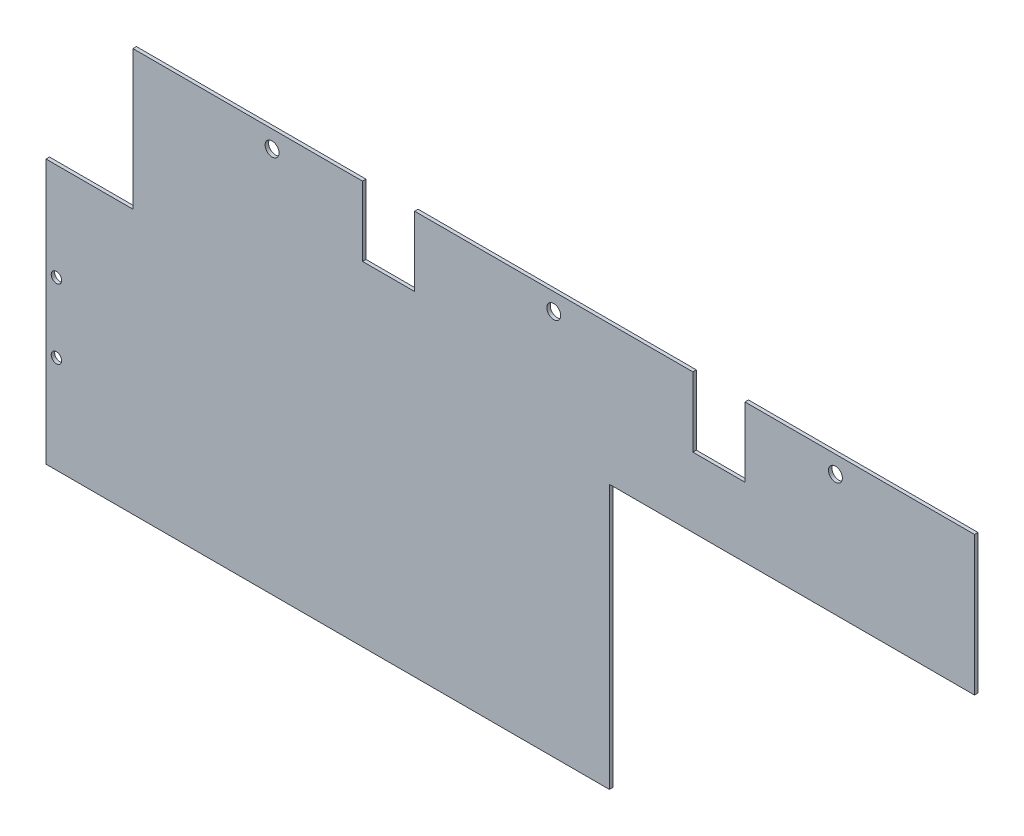
ISO-10303-21;
HEADER;
FILE_DESCRIPTION(('STEP AP214'),'2;1');
FILE_NAME('part.step','',(''),(''),'','','');
FILE_SCHEMA(('AUTOMOTIVE_DESIGN { 1 0 10303 214 1 1 1 1 }'));
ENDSEC;
DATA;
#1=APPLICATION_CONTEXT('core data for automotive mechanical design processes');
#2=APPLICATION_PROTOCOL_DEFINITION('international standard','automotive_design',2000,#1);
#3=PRODUCT_CONTEXT('',#1,'mechanical');
#4=PRODUCT('Part','Part','',(#3));
#5=PRODUCT_RELATED_PRODUCT_CATEGORY('part','',(#4));
#6=PRODUCT_DEFINITION_FORMATION('','',#4);
#7=PRODUCT_DEFINITION_CONTEXT('part definition',#1,'design');
#8=PRODUCT_DEFINITION('design','',#6,#7);
#9=PRODUCT_DEFINITION_SHAPE('','',#8);
#10=(LENGTH_UNIT() NAMED_UNIT(*) SI_UNIT(.MILLI.,.METRE.));
#11=(NAMED_UNIT(*) PLANE_ANGLE_UNIT() SI_UNIT($,.RADIAN.));
#12=(NAMED_UNIT(*) SI_UNIT($,.STERADIAN.) SOLID_ANGLE_UNIT());
#13=UNCERTAINTY_MEASURE_WITH_UNIT(LENGTH_MEASURE(1.E-05),#10,'distance_accuracy_value','');
#14=(GEOMETRIC_REPRESENTATION_CONTEXT(3) GLOBAL_UNCERTAINTY_ASSIGNED_CONTEXT((#13)) GLOBAL_UNIT_ASSIGNED_CONTEXT((#10,
#11,#12)) REPRESENTATION_CONTEXT('',''));
#15=CARTESIAN_POINT('',(0.,0.,0.));
#16=DIRECTION('',(0.,0.,1.));
#17=DIRECTION('',(1.,0.,0.));
#18=AXIS2_PLACEMENT_3D('',#15,#16,#17);
#19=CARTESIAN_POINT('',(25.,116.,1.));
#20=DIRECTION('',(0.,-1.,0.));
#21=DIRECTION('',(0.,0.,-1.));
#22=AXIS2_PLACEMENT_3D('',#19,#20,#21);
#23=PLANE('',#22);
#24=DIRECTION('',(-1.,0.,0.));
#25=VECTOR('',#24,1.);
#26=CARTESIAN_POINT('',(25.,116.,0.));
#27=LINE('',#26,#25);
#28=CARTESIAN_POINT('',(267.,116.,0.));
#29=VERTEX_POINT('',#28);
#30=CARTESIAN_POINT('',(201.,116.,0.));
#31=VERTEX_POINT('',#30);
#32=EDGE_CURVE('E278',#29,#31,#27,.T.);
#33=ORIENTED_EDGE('',*,*,#32,.T.);
#34=DIRECTION('',(0.,0.,1.));
#35=VECTOR('',#34,1.);
#36=CARTESIAN_POINT('',(201.,116.,0.));
#37=LINE('',#36,#35);
#38=CARTESIAN_POINT('',(201.,116.,1.));
#39=VERTEX_POINT('',#38);
#40=EDGE_CURVE('E208',#31,#39,#37,.T.);
#41=ORIENTED_EDGE('',*,*,#40,.T.);
#42=DIRECTION('',(-1.,0.,0.));
#43=VECTOR('',#42,1.);
#44=CARTESIAN_POINT('',(25.,116.,1.));
#45=LINE('',#44,#43);
#46=CARTESIAN_POINT('',(267.,116.,1.));
#47=VERTEX_POINT('',#46);
#48=EDGE_CURVE('E264',#47,#39,#45,.T.);
#49=ORIENTED_EDGE('',*,*,#48,.F.);
#50=DIRECTION('',(0.,0.,-1.));
#51=VECTOR('',#50,1.);
#52=CARTESIAN_POINT('',(267.,116.,1.));
#53=LINE('',#52,#51);
#54=EDGE_CURVE('E44',#47,#29,#53,.T.);
#55=ORIENTED_EDGE('',*,*,#54,.T.);
#56=EDGE_LOOP('',(#33,#41,#49,#55));
#57=FACE_BOUND('',#56,.T.);
#58=ADVANCED_FACE('F36',(#57),#23,.F.);
#59=CARTESIAN_POINT('',(91.,116.,1.));
#60=VERTEX_POINT('',#59);
#61=CARTESIAN_POINT('',(25.,116.,1.));
#62=VERTEX_POINT('',#61);
#63=EDGE_CURVE('E263',#60,#62,#45,.T.);
#64=ORIENTED_EDGE('',*,*,#63,.F.);
#65=DIRECTION('',(0.,0.,1.));
#66=VECTOR('',#65,1.);
#67=CARTESIAN_POINT('',(91.,116.,0.));
#68=LINE('',#67,#66);
#69=CARTESIAN_POINT('',(91.,116.,0.));
#70=VERTEX_POINT('',#69);
#71=EDGE_CURVE('E237',#70,#60,#68,.T.);
#72=ORIENTED_EDGE('',*,*,#71,.F.);
#73=CARTESIAN_POINT('',(25.,116.,0.));
#74=VERTEX_POINT('',#73);
#75=EDGE_CURVE('E277',#70,#74,#27,.T.);
#76=ORIENTED_EDGE('',*,*,#75,.T.);
#77=DIRECTION('',(0.,0.,-1.));
#78=VECTOR('',#77,1.);
#79=CARTESIAN_POINT('',(25.,116.,1.));
#80=LINE('',#79,#78);
#81=EDGE_CURVE('E295',#62,#74,#80,.T.);
#82=ORIENTED_EDGE('',*,*,#81,.F.);
#83=EDGE_LOOP('',(#64,#72,#76,#82));
#84=FACE_BOUND('',#83,.T.);
#85=ADVANCED_FACE('F322',(#84),#23,.F.);
#86=CARTESIAN_POINT('',(0.,0.,1.));
#87=DIRECTION('',(0.,0.,-1.));
#88=DIRECTION('',(-1.,0.,0.));
#89=AXIS2_PLACEMENT_3D('',#86,#87,#88);
#90=PLANE('',#89);
#91=CARTESIAN_POINT('',(65.,111.,1.));
#92=DIRECTION('',(0.,0.,1.));
#93=DIRECTION('',(1.,0.,0.));
#94=AXIS2_PLACEMENT_3D('',#91,#92,#93);
#95=CIRCLE('',#94,2.);
#96=CARTESIAN_POINT('',(67.,111.,1.));
#97=VERTEX_POINT('',#96);
#98=EDGE_CURVE('E182',#97,#97,#95,.T.);
#99=ORIENTED_EDGE('',*,*,#98,.F.);
#100=EDGE_LOOP('',(#99));
#101=FACE_BOUND('',#100,.T.);
#102=CARTESIAN_POINT('',(227.,111.,1.));
#103=DIRECTION('',(0.,0.,1.));
#104=DIRECTION('',(-1.,0.,0.));
#105=AXIS2_PLACEMENT_3D('',#102,#103,#104);
#106=CIRCLE('',#105,2.);
#107=CARTESIAN_POINT('',(225.,111.,1.));
#108=VERTEX_POINT('',#107);
#109=EDGE_CURVE('E183',#108,#108,#106,.T.);
#110=ORIENTED_EDGE('',*,*,#109,.F.);
#111=EDGE_LOOP('',(#110));
#112=FACE_BOUND('',#111,.T.);
#113=CARTESIAN_POINT('',(146.,111.,1.));
#114=DIRECTION('',(0.,0.,1.));
#115=DIRECTION('',(1.,0.,0.));
#116=AXIS2_PLACEMENT_3D('',#113,#114,#115);
#117=CIRCLE('',#116,2.);
#118=CARTESIAN_POINT('',(148.,111.,1.));
#119=VERTEX_POINT('',#118);
#120=EDGE_CURVE('E177',#119,#119,#117,.T.);
#121=ORIENTED_EDGE('',*,*,#120,.F.);
#122=EDGE_LOOP('',(#121));
#123=FACE_BOUND('',#122,.T.);
#124=DIRECTION('',(1.,0.,0.));
#125=VECTOR('',#124,1.);
#126=CARTESIAN_POINT('',(292.,0.,1.));
#127=LINE('',#126,#125);
#128=CARTESIAN_POINT('',(0.,0.,1.));
#129=VERTEX_POINT('',#128);
#130=CARTESIAN_POINT('',(162.,0.,1.));
#131=VERTEX_POINT('',#130);
#132=EDGE_CURVE('E257',#129,#131,#127,.T.);
#133=ORIENTED_EDGE('',*,*,#132,.T.);
#134=DIRECTION('',(0.,-1.,0.));
#135=VECTOR('',#134,1.);
#136=CARTESIAN_POINT('',(162.,0.,1.));
#137=LINE('',#136,#135);
#138=CARTESIAN_POINT('',(162.,76.,1.));
#139=VERTEX_POINT('',#138);
#140=EDGE_CURVE('E172',#139,#131,#137,.T.);
#141=ORIENTED_EDGE('',*,*,#140,.F.);
#142=DIRECTION('',(-1.,0.,0.));
#143=VECTOR('',#142,1.);
#144=CARTESIAN_POINT('',(292.,76.,1.));
#145=LINE('',#144,#143);
#146=CARTESIAN_POINT('',(267.,76.,1.));
#147=VERTEX_POINT('',#146);
#148=EDGE_CURVE('E154',#147,#139,#145,.T.);
#149=ORIENTED_EDGE('',*,*,#148,.F.);
#150=DIRECTION('',(0.,1.,0.));
#151=VECTOR('',#150,1.);
#152=CARTESIAN_POINT('',(267.,116.,1.));
#153=LINE('',#152,#151);
#154=EDGE_CURVE('E260',#147,#47,#153,.T.);
#155=ORIENTED_EDGE('',*,*,#154,.T.);
#156=ORIENTED_EDGE('',*,*,#48,.T.);
#157=DIRECTION('',(0.,1.,0.));
#158=VECTOR('',#157,1.);
#159=CARTESIAN_POINT('',(201.,116.,1.));
#160=LINE('',#159,#158);
#161=CARTESIAN_POINT('',(201.,96.,1.));
#162=VERTEX_POINT('',#161);
#163=EDGE_CURVE('E193',#162,#39,#160,.T.);
#164=ORIENTED_EDGE('',*,*,#163,.F.);
#165=DIRECTION('',(1.,0.,0.));
#166=VECTOR('',#165,1.);
#167=CARTESIAN_POINT('',(201.,96.,1.));
#168=LINE('',#167,#166);
#169=CARTESIAN_POINT('',(186.,96.,1.));
#170=VERTEX_POINT('',#169);
#171=EDGE_CURVE('E203',#170,#162,#168,.T.);
#172=ORIENTED_EDGE('',*,*,#171,.F.);
#173=DIRECTION('',(0.,-1.,0.));
#174=VECTOR('',#173,1.);
#175=CARTESIAN_POINT('',(186.,116.,1.));
#176=LINE('',#175,#174);
#177=CARTESIAN_POINT('',(186.,116.,1.));
#178=VERTEX_POINT('',#177);
#179=EDGE_CURVE('E200',#178,#170,#176,.T.);
#180=ORIENTED_EDGE('',*,*,#179,.F.);
#181=CARTESIAN_POINT('',(106.,116.,1.));
#182=VERTEX_POINT('',#181);
#183=EDGE_CURVE('E268',#178,#182,#45,.T.);
#184=ORIENTED_EDGE('',*,*,#183,.T.);
#185=DIRECTION('',(0.,1.,0.));
#186=VECTOR('',#185,1.);
#187=CARTESIAN_POINT('',(106.,116.,1.));
#188=LINE('',#187,#186);
#189=CARTESIAN_POINT('',(106.,96.,1.));
#190=VERTEX_POINT('',#189);
#191=EDGE_CURVE('E51',#190,#182,#188,.T.);
#192=ORIENTED_EDGE('',*,*,#191,.F.);
#193=DIRECTION('',(1.,0.,0.));
#194=VECTOR('',#193,1.);
#195=CARTESIAN_POINT('',(91.,96.,1.));
#196=LINE('',#195,#194);
#197=CARTESIAN_POINT('',(91.,96.,1.));
#198=VERTEX_POINT('',#197);
#199=EDGE_CURVE('E233',#198,#190,#196,.T.);
#200=ORIENTED_EDGE('',*,*,#199,.F.);
#201=DIRECTION('',(0.,-1.,0.));
#202=VECTOR('',#201,1.);
#203=CARTESIAN_POINT('',(91.,116.,1.));
#204=LINE('',#203,#202);
#205=EDGE_CURVE('E211',#60,#198,#204,.T.);
#206=ORIENTED_EDGE('',*,*,#205,.F.);
#207=ORIENTED_EDGE('',*,*,#63,.T.);
#208=DIRECTION('',(0.,-1.,0.));
#209=VECTOR('',#208,1.);
#210=CARTESIAN_POINT('',(25.,76.,1.));
#211=LINE('',#210,#209);
#212=CARTESIAN_POINT('',(25.,76.,1.));
#213=VERTEX_POINT('',#212);
#214=EDGE_CURVE('E267',#62,#213,#211,.T.);
#215=ORIENTED_EDGE('',*,*,#214,.T.);
#216=DIRECTION('',(-1.,0.,0.));
#217=VECTOR('',#216,1.);
#218=CARTESIAN_POINT('',(0.,76.,1.));
#219=LINE('',#218,#217);
#220=CARTESIAN_POINT('',(0.,76.,1.));
#221=VERTEX_POINT('',#220);
#222=EDGE_CURVE('E270',#213,#221,#219,.T.);
#223=ORIENTED_EDGE('',*,*,#222,.T.);
#224=DIRECTION('',(0.,-1.,0.));
#225=VECTOR('',#224,1.);
#226=CARTESIAN_POINT('',(0.,0.,1.));
#227=LINE('',#226,#225);
#228=EDGE_CURVE('E272',#221,#129,#227,.T.);
#229=ORIENTED_EDGE('',*,*,#228,.T.);
#230=EDGE_LOOP('',(#133,#141,#149,#155,#156,#164,#172,#180,#184,#192,#200,#206,#207,#215,#223,#229));
#231=FACE_BOUND('',#230,.T.);
#232=CARTESIAN_POINT('',(3.,48.,1.));
#233=DIRECTION('',(0.,0.,1.));
#234=DIRECTION('',(1.,0.,0.));
#235=AXIS2_PLACEMENT_3D('',#232,#233,#234);
#236=CIRCLE('',#235,1.5);
#237=CARTESIAN_POINT('',(4.5,48.,1.));
#238=VERTEX_POINT('',#237);
#239=EDGE_CURVE('E251',#238,#238,#236,.T.);
#240=ORIENTED_EDGE('',*,*,#239,.F.);
#241=EDGE_LOOP('',(#240));
#242=FACE_BOUND('',#241,.T.);
#243=CARTESIAN_POINT('',(3.,28.,1.));
#244=DIRECTION('',(0.,0.,1.));
#245=DIRECTION('',(1.,0.,0.));
#246=AXIS2_PLACEMENT_3D('',#243,#244,#245);
#247=CIRCLE('',#246,1.5);
#248=CARTESIAN_POINT('',(4.5,28.,1.));
#249=VERTEX_POINT('',#248);
#250=EDGE_CURVE('E245',#249,#249,#247,.T.);
#251=ORIENTED_EDGE('',*,*,#250,.F.);
#252=EDGE_LOOP('',(#251));
#253=FACE_BOUND('',#252,.T.);
#254=ADVANCED_FACE('F309',(#101,#112,#123,#231,#242,#253),#90,.F.);
#255=CARTESIAN_POINT('',(0.,0.,0.));
#256=DIRECTION('',(0.,0.,-1.));
#257=DIRECTION('',(-1.,0.,0.));
#258=AXIS2_PLACEMENT_3D('',#255,#256,#257);
#259=PLANE('',#258);
#260=DIRECTION('',(0.,-1.,0.));
#261=VECTOR('',#260,1.);
#262=CARTESIAN_POINT('',(162.,0.,0.));
#263=LINE('',#262,#261);
#264=CARTESIAN_POINT('',(162.,76.,0.));
#265=VERTEX_POINT('',#264);
#266=CARTESIAN_POINT('',(162.,0.,0.));
#267=VERTEX_POINT('',#266);
#268=EDGE_CURVE('E158',#265,#267,#263,.T.);
#269=ORIENTED_EDGE('',*,*,#268,.T.);
#270=DIRECTION('',(1.,0.,0.));
#271=VECTOR('',#270,1.);
#272=CARTESIAN_POINT('',(292.,0.,0.));
#273=LINE('',#272,#271);
#274=CARTESIAN_POINT('',(0.,0.,0.));
#275=VERTEX_POINT('',#274);
#276=EDGE_CURVE('E254',#275,#267,#273,.T.);
#277=ORIENTED_EDGE('',*,*,#276,.F.);
#278=DIRECTION('',(0.,-1.,0.));
#279=VECTOR('',#278,1.);
#280=CARTESIAN_POINT('',(0.,0.,0.));
#281=LINE('',#280,#279);
#282=CARTESIAN_POINT('',(0.,76.,0.));
#283=VERTEX_POINT('',#282);
#284=EDGE_CURVE('E261',#283,#275,#281,.T.);
#285=ORIENTED_EDGE('',*,*,#284,.F.);
#286=DIRECTION('',(-1.,0.,0.));
#287=VECTOR('',#286,1.);
#288=CARTESIAN_POINT('',(0.,76.,0.));
#289=LINE('',#288,#287);
#290=CARTESIAN_POINT('',(25.,76.,0.));
#291=VERTEX_POINT('',#290);
#292=EDGE_CURVE('E284',#291,#283,#289,.T.);
#293=ORIENTED_EDGE('',*,*,#292,.F.);
#294=DIRECTION('',(0.,-1.,0.));
#295=VECTOR('',#294,1.);
#296=CARTESIAN_POINT('',(25.,76.,0.));
#297=LINE('',#296,#295);
#298=EDGE_CURVE('E281',#74,#291,#297,.T.);
#299=ORIENTED_EDGE('',*,*,#298,.F.);
#300=ORIENTED_EDGE('',*,*,#75,.F.);
#301=DIRECTION('',(0.,-1.,0.));
#302=VECTOR('',#301,1.);
#303=CARTESIAN_POINT('',(91.,116.,0.));
#304=LINE('',#303,#302);
#305=CARTESIAN_POINT('',(91.,96.,0.));
#306=VERTEX_POINT('',#305);
#307=EDGE_CURVE('E221',#70,#306,#304,.T.);
#308=ORIENTED_EDGE('',*,*,#307,.T.);
#309=DIRECTION('',(1.,0.,0.));
#310=VECTOR('',#309,1.);
#311=CARTESIAN_POINT('',(91.,96.,0.));
#312=LINE('',#311,#310);
#313=CARTESIAN_POINT('',(106.,96.,0.));
#314=VERTEX_POINT('',#313);
#315=EDGE_CURVE('E224',#306,#314,#312,.T.);
#316=ORIENTED_EDGE('',*,*,#315,.T.);
#317=DIRECTION('',(0.,1.,0.));
#318=VECTOR('',#317,1.);
#319=CARTESIAN_POINT('',(106.,116.,0.));
#320=LINE('',#319,#318);
#321=CARTESIAN_POINT('',(106.,116.,0.));
#322=VERTEX_POINT('',#321);
#323=EDGE_CURVE('E227',#314,#322,#320,.T.);
#324=ORIENTED_EDGE('',*,*,#323,.T.);
#325=CARTESIAN_POINT('',(186.,116.,0.));
#326=VERTEX_POINT('',#325);
#327=EDGE_CURVE('E282',#326,#322,#27,.T.);
#328=ORIENTED_EDGE('',*,*,#327,.F.);
#329=DIRECTION('',(0.,-1.,0.));
#330=VECTOR('',#329,1.);
#331=CARTESIAN_POINT('',(186.,116.,0.));
#332=LINE('',#331,#330);
#333=CARTESIAN_POINT('',(186.,96.,0.));
#334=VERTEX_POINT('',#333);
#335=EDGE_CURVE('E59',#326,#334,#332,.T.);
#336=ORIENTED_EDGE('',*,*,#335,.T.);
#337=DIRECTION('',(1.,0.,0.));
#338=VECTOR('',#337,1.);
#339=CARTESIAN_POINT('',(201.,96.,0.));
#340=LINE('',#339,#338);
#341=CARTESIAN_POINT('',(201.,96.,0.));
#342=VERTEX_POINT('',#341);
#343=EDGE_CURVE('E192',#334,#342,#340,.T.);
#344=ORIENTED_EDGE('',*,*,#343,.T.);
#345=DIRECTION('',(0.,1.,0.));
#346=VECTOR('',#345,1.);
#347=CARTESIAN_POINT('',(201.,116.,0.));
#348=LINE('',#347,#346);
#349=EDGE_CURVE('E196',#342,#31,#348,.T.);
#350=ORIENTED_EDGE('',*,*,#349,.T.);
#351=ORIENTED_EDGE('',*,*,#32,.F.);
#352=DIRECTION('',(0.,1.,0.));
#353=VECTOR('',#352,1.);
#354=CARTESIAN_POINT('',(267.,116.,0.));
#355=LINE('',#354,#353);
#356=CARTESIAN_POINT('',(267.,76.,0.));
#357=VERTEX_POINT('',#356);
#358=EDGE_CURVE('E171',#357,#29,#355,.T.);
#359=ORIENTED_EDGE('',*,*,#358,.F.);
#360=DIRECTION('',(-1.,0.,0.));
#361=VECTOR('',#360,1.);
#362=CARTESIAN_POINT('',(292.,76.,0.));
#363=LINE('',#362,#361);
#364=EDGE_CURVE('E152',#357,#265,#363,.T.);
#365=ORIENTED_EDGE('',*,*,#364,.T.);
#366=EDGE_LOOP('',(#269,#277,#285,#293,#299,#300,#308,#316,#324,#328,#336,#344,#350,#351,#359,#365));
#367=FACE_BOUND('',#366,.T.);
#368=CARTESIAN_POINT('',(65.,111.,0.));
#369=DIRECTION('',(0.,0.,1.));
#370=DIRECTION('',(1.,0.,0.));
#371=AXIS2_PLACEMENT_3D('',#368,#369,#370);
#372=CIRCLE('',#371,2.);
#373=CARTESIAN_POINT('',(67.,111.,0.));
#374=VERTEX_POINT('',#373);
#375=EDGE_CURVE('E204',#374,#374,#372,.T.);
#376=ORIENTED_EDGE('',*,*,#375,.T.);
#377=EDGE_LOOP('',(#376));
#378=FACE_BOUND('',#377,.T.);
#379=CARTESIAN_POINT('',(227.,111.,0.));
#380=DIRECTION('',(0.,0.,1.));
#381=DIRECTION('',(-1.,0.,0.));
#382=AXIS2_PLACEMENT_3D('',#379,#380,#381);
#383=CIRCLE('',#382,2.);
#384=CARTESIAN_POINT('',(225.,111.,0.));
#385=VERTEX_POINT('',#384);
#386=EDGE_CURVE('E179',#385,#385,#383,.T.);
#387=ORIENTED_EDGE('',*,*,#386,.T.);
#388=EDGE_LOOP('',(#387));
#389=FACE_BOUND('',#388,.T.);
#390=CARTESIAN_POINT('',(146.,111.,0.));
#391=DIRECTION('',(0.,0.,1.));
#392=DIRECTION('',(1.,0.,0.));
#393=AXIS2_PLACEMENT_3D('',#390,#391,#392);
#394=CIRCLE('',#393,2.);
#395=CARTESIAN_POINT('',(148.,111.,0.));
#396=VERTEX_POINT('',#395);
#397=EDGE_CURVE('E186',#396,#396,#394,.T.);
#398=ORIENTED_EDGE('',*,*,#397,.T.);
#399=EDGE_LOOP('',(#398));
#400=FACE_BOUND('',#399,.T.);
#401=CARTESIAN_POINT('',(3.,48.,0.));
#402=DIRECTION('',(0.,0.,1.));
#403=DIRECTION('',(1.,0.,0.));
#404=AXIS2_PLACEMENT_3D('',#401,#402,#403);
#405=CIRCLE('',#404,1.5);
#406=CARTESIAN_POINT('',(4.5,48.,0.));
#407=VERTEX_POINT('',#406);
#408=EDGE_CURVE('E248',#407,#407,#405,.T.);
#409=ORIENTED_EDGE('',*,*,#408,.T.);
#410=EDGE_LOOP('',(#409));
#411=FACE_BOUND('',#410,.T.);
#412=CARTESIAN_POINT('',(3.,28.,0.));
#413=DIRECTION('',(0.,0.,1.));
#414=DIRECTION('',(1.,0.,0.));
#415=AXIS2_PLACEMENT_3D('',#412,#413,#414);
#416=CIRCLE('',#415,1.5);
#417=CARTESIAN_POINT('',(4.5,28.,0.));
#418=VERTEX_POINT('',#417);
#419=EDGE_CURVE('E239',#418,#418,#416,.T.);
#420=ORIENTED_EDGE('',*,*,#419,.T.);
#421=EDGE_LOOP('',(#420));
#422=FACE_BOUND('',#421,.T.);
#423=ADVANCED_FACE('F168',(#367,#378,#389,#400,#411,#422),#259,.T.);
#424=CARTESIAN_POINT('',(292.,0.,1.));
#425=DIRECTION('',(0.,1.,0.));
#426=DIRECTION('',(0.,0.,1.));
#427=AXIS2_PLACEMENT_3D('',#424,#425,#426);
#428=PLANE('',#427);
#429=ORIENTED_EDGE('',*,*,#276,.T.);
#430=DIRECTION('',(0.,0.,1.));
#431=VECTOR('',#430,1.);
#432=CARTESIAN_POINT('',(162.,0.,0.));
#433=LINE('',#432,#431);
#434=EDGE_CURVE('E157',#267,#131,#433,.T.);
#435=ORIENTED_EDGE('',*,*,#434,.T.);
#436=ORIENTED_EDGE('',*,*,#132,.F.);
#437=DIRECTION('',(0.,0.,-1.));
#438=VECTOR('',#437,1.);
#439=CARTESIAN_POINT('',(0.,0.,1.));
#440=LINE('',#439,#438);
#441=EDGE_CURVE('E274',#129,#275,#440,.T.);
#442=ORIENTED_EDGE('',*,*,#441,.T.);
#443=EDGE_LOOP('',(#429,#435,#436,#442));
#444=FACE_BOUND('',#443,.T.);
#445=ADVANCED_FACE('F38',(#444),#428,.F.);
#446=CARTESIAN_POINT('',(267.,116.,1.));
#447=DIRECTION('',(-1.,0.,0.));
#448=DIRECTION('',(0.,0.,1.));
#449=AXIS2_PLACEMENT_3D('',#446,#447,#448);
#450=PLANE('',#449);
#451=ORIENTED_EDGE('',*,*,#358,.T.);
#452=ORIENTED_EDGE('',*,*,#54,.F.);
#453=ORIENTED_EDGE('',*,*,#154,.F.);
#454=DIRECTION('',(0.,0.,-1.));
#455=VECTOR('',#454,1.);
#456=CARTESIAN_POINT('',(267.,76.,1.));
#457=LINE('',#456,#455);
#458=EDGE_CURVE('E11',#147,#357,#457,.T.);
#459=ORIENTED_EDGE('',*,*,#458,.T.);
#460=EDGE_LOOP('',(#451,#452,#453,#459));
#461=FACE_BOUND('',#460,.T.);
#462=ADVANCED_FACE('F312',(#461),#450,.F.);
#463=ORIENTED_EDGE('',*,*,#183,.F.);
#464=DIRECTION('',(0.,0.,1.));
#465=VECTOR('',#464,1.);
#466=CARTESIAN_POINT('',(186.,116.,0.));
#467=LINE('',#466,#465);
#468=EDGE_CURVE('E199',#326,#178,#467,.T.);
#469=ORIENTED_EDGE('',*,*,#468,.F.);
#470=ORIENTED_EDGE('',*,*,#327,.T.);
#471=DIRECTION('',(0.,0.,1.));
#472=VECTOR('',#471,1.);
#473=CARTESIAN_POINT('',(106.,116.,0.));
#474=LINE('',#473,#472);
#475=EDGE_CURVE('E240',#322,#182,#474,.T.);
#476=ORIENTED_EDGE('',*,*,#475,.T.);
#477=EDGE_LOOP('',(#463,#469,#470,#476));
#478=FACE_BOUND('',#477,.T.);
#479=ADVANCED_FACE('F314',(#478),#23,.F.);
#480=CARTESIAN_POINT('',(25.,76.,1.));
#481=DIRECTION('',(1.,0.,0.));
#482=DIRECTION('',(0.,0.,-1.));
#483=AXIS2_PLACEMENT_3D('',#480,#481,#482);
#484=PLANE('',#483);
#485=ORIENTED_EDGE('',*,*,#298,.T.);
#486=DIRECTION('',(0.,0.,-1.));
#487=VECTOR('',#486,1.);
#488=CARTESIAN_POINT('',(25.,76.,1.));
#489=LINE('',#488,#487);
#490=EDGE_CURVE('E292',#213,#291,#489,.T.);
#491=ORIENTED_EDGE('',*,*,#490,.F.);
#492=ORIENTED_EDGE('',*,*,#214,.F.);
#493=ORIENTED_EDGE('',*,*,#81,.T.);
#494=EDGE_LOOP('',(#485,#491,#492,#493));
#495=FACE_BOUND('',#494,.T.);
#496=ADVANCED_FACE('F319',(#495),#484,.F.);
#497=CARTESIAN_POINT('',(0.,76.,1.));
#498=DIRECTION('',(0.,-1.,0.));
#499=DIRECTION('',(1.,0.,0.));
#500=AXIS2_PLACEMENT_3D('',#497,#498,#499);
#501=PLANE('',#500);
#502=ORIENTED_EDGE('',*,*,#292,.T.);
#503=DIRECTION('',(0.,0.,-1.));
#504=VECTOR('',#503,1.);
#505=CARTESIAN_POINT('',(0.,76.,1.));
#506=LINE('',#505,#504);
#507=EDGE_CURVE('E289',#221,#283,#506,.T.);
#508=ORIENTED_EDGE('',*,*,#507,.F.);
#509=ORIENTED_EDGE('',*,*,#222,.F.);
#510=ORIENTED_EDGE('',*,*,#490,.T.);
#511=EDGE_LOOP('',(#502,#508,#509,#510));
#512=FACE_BOUND('',#511,.T.);
#513=ADVANCED_FACE('F332',(#512),#501,.F.);
#514=CARTESIAN_POINT('',(0.,0.,1.));
#515=DIRECTION('',(1.,0.,0.));
#516=DIRECTION('',(0.,0.,-1.));
#517=AXIS2_PLACEMENT_3D('',#514,#515,#516);
#518=PLANE('',#517);
#519=ORIENTED_EDGE('',*,*,#284,.T.);
#520=ORIENTED_EDGE('',*,*,#441,.F.);
#521=ORIENTED_EDGE('',*,*,#228,.F.);
#522=ORIENTED_EDGE('',*,*,#507,.T.);
#523=EDGE_LOOP('',(#519,#520,#521,#522));
#524=FACE_BOUND('',#523,.T.);
#525=ADVANCED_FACE('F336',(#524),#518,.F.);
#526=CARTESIAN_POINT('',(3.,48.,1.));
#527=DIRECTION('',(0.,0.,-1.));
#528=DIRECTION('',(-1.,0.,0.));
#529=AXIS2_PLACEMENT_3D('',#526,#527,#528);
#530=CYLINDRICAL_SURFACE('',#529,1.5);
#531=ORIENTED_EDGE('',*,*,#239,.T.);
#532=EDGE_LOOP('',(#531));
#533=FACE_BOUND('',#532,.T.);
#534=ORIENTED_EDGE('',*,*,#408,.F.);
#535=EDGE_LOOP('',(#534));
#536=FACE_BOUND('',#535,.T.);
#537=ADVANCED_FACE('F340',(#533,#536),#530,.F.);
#538=CARTESIAN_POINT('',(3.,28.,1.));
#539=DIRECTION('',(0.,0.,-1.));
#540=DIRECTION('',(-1.,0.,0.));
#541=AXIS2_PLACEMENT_3D('',#538,#539,#540);
#542=CYLINDRICAL_SURFACE('',#541,1.5);
#543=ORIENTED_EDGE('',*,*,#250,.T.);
#544=EDGE_LOOP('',(#543));
#545=FACE_BOUND('',#544,.T.);
#546=ORIENTED_EDGE('',*,*,#419,.F.);
#547=EDGE_LOOP('',(#546));
#548=FACE_BOUND('',#547,.T.);
#549=ADVANCED_FACE('F349',(#545,#548),#542,.F.);
#550=CARTESIAN_POINT('',(91.,116.,0.));
#551=DIRECTION('',(-1.,0.,0.));
#552=DIRECTION('',(0.,0.,1.));
#553=AXIS2_PLACEMENT_3D('',#550,#551,#552);
#554=PLANE('',#553);
#555=ORIENTED_EDGE('',*,*,#205,.T.);
#556=DIRECTION('',(0.,0.,1.));
#557=VECTOR('',#556,1.);
#558=CARTESIAN_POINT('',(91.,96.,0.));
#559=LINE('',#558,#557);
#560=EDGE_CURVE('E230',#306,#198,#559,.T.);
#561=ORIENTED_EDGE('',*,*,#560,.F.);
#562=ORIENTED_EDGE('',*,*,#307,.F.);
#563=ORIENTED_EDGE('',*,*,#71,.T.);
#564=EDGE_LOOP('',(#555,#561,#562,#563));
#565=FACE_BOUND('',#564,.T.);
#566=ADVANCED_FACE('F353',(#565),#554,.F.);
#567=CARTESIAN_POINT('',(106.,116.,0.));
#568=DIRECTION('',(1.,0.,0.));
#569=DIRECTION('',(0.,1.,0.));
#570=AXIS2_PLACEMENT_3D('',#567,#568,#569);
#571=PLANE('',#570);
#572=ORIENTED_EDGE('',*,*,#191,.T.);
#573=ORIENTED_EDGE('',*,*,#475,.F.);
#574=ORIENTED_EDGE('',*,*,#323,.F.);
#575=DIRECTION('',(0.,0.,1.));
#576=VECTOR('',#575,1.);
#577=CARTESIAN_POINT('',(106.,96.,0.));
#578=LINE('',#577,#576);
#579=EDGE_CURVE('E242',#314,#190,#578,.T.);
#580=ORIENTED_EDGE('',*,*,#579,.T.);
#581=EDGE_LOOP('',(#572,#573,#574,#580));
#582=FACE_BOUND('',#581,.T.);
#583=ADVANCED_FACE('F357',(#582),#571,.F.);
#584=CARTESIAN_POINT('',(91.,96.,0.));
#585=DIRECTION('',(0.,-1.,0.));
#586=DIRECTION('',(0.,0.,-1.));
#587=AXIS2_PLACEMENT_3D('',#584,#585,#586);
#588=PLANE('',#587);
#589=ORIENTED_EDGE('',*,*,#199,.T.);
#590=ORIENTED_EDGE('',*,*,#579,.F.);
#591=ORIENTED_EDGE('',*,*,#315,.F.);
#592=ORIENTED_EDGE('',*,*,#560,.T.);
#593=EDGE_LOOP('',(#589,#590,#591,#592));
#594=FACE_BOUND('',#593,.T.);
#595=ADVANCED_FACE('F359',(#594),#588,.F.);
#596=CARTESIAN_POINT('',(201.,116.,0.));
#597=DIRECTION('',(1.,0.,0.));
#598=DIRECTION('',(0.,0.,-1.));
#599=AXIS2_PLACEMENT_3D('',#596,#597,#598);
#600=PLANE('',#599);
#601=ORIENTED_EDGE('',*,*,#163,.T.);
#602=ORIENTED_EDGE('',*,*,#40,.F.);
#603=ORIENTED_EDGE('',*,*,#349,.F.);
#604=DIRECTION('',(0.,0.,1.));
#605=VECTOR('',#604,1.);
#606=CARTESIAN_POINT('',(201.,96.,0.));
#607=LINE('',#606,#605);
#608=EDGE_CURVE('E212',#342,#162,#607,.T.);
#609=ORIENTED_EDGE('',*,*,#608,.T.);
#610=EDGE_LOOP('',(#601,#602,#603,#609));
#611=FACE_BOUND('',#610,.T.);
#612=ADVANCED_FACE('F306',(#611),#600,.F.);
#613=CARTESIAN_POINT('',(201.,96.,0.));
#614=DIRECTION('',(0.,-1.,0.));
#615=DIRECTION('',(0.,0.,-1.));
#616=AXIS2_PLACEMENT_3D('',#613,#614,#615);
#617=PLANE('',#616);
#618=ORIENTED_EDGE('',*,*,#171,.T.);
#619=ORIENTED_EDGE('',*,*,#608,.F.);
#620=ORIENTED_EDGE('',*,*,#343,.F.);
#621=DIRECTION('',(0.,0.,1.));
#622=VECTOR('',#621,1.);
#623=CARTESIAN_POINT('',(186.,96.,0.));
#624=LINE('',#623,#622);
#625=EDGE_CURVE('E214',#334,#170,#624,.T.);
#626=ORIENTED_EDGE('',*,*,#625,.T.);
#627=EDGE_LOOP('',(#618,#619,#620,#626));
#628=FACE_BOUND('',#627,.T.);
#629=ADVANCED_FACE('F374',(#628),#617,.F.);
#630=CARTESIAN_POINT('',(186.,116.,0.));
#631=DIRECTION('',(-1.,0.,0.));
#632=DIRECTION('',(0.,-1.,0.));
#633=AXIS2_PLACEMENT_3D('',#630,#631,#632);
#634=PLANE('',#633);
#635=ORIENTED_EDGE('',*,*,#179,.T.);
#636=ORIENTED_EDGE('',*,*,#625,.F.);
#637=ORIENTED_EDGE('',*,*,#335,.F.);
#638=ORIENTED_EDGE('',*,*,#468,.T.);
#639=EDGE_LOOP('',(#635,#636,#637,#638));
#640=FACE_BOUND('',#639,.T.);
#641=ADVANCED_FACE('F370',(#640),#634,.F.);
#642=CARTESIAN_POINT('',(146.,111.,0.));
#643=DIRECTION('',(0.,0.,1.));
#644=DIRECTION('',(1.,0.,0.));
#645=AXIS2_PLACEMENT_3D('',#642,#643,#644);
#646=CYLINDRICAL_SURFACE('',#645,2.);
#647=ORIENTED_EDGE('',*,*,#397,.F.);
#648=EDGE_LOOP('',(#647));
#649=FACE_BOUND('',#648,.T.);
#650=ORIENTED_EDGE('',*,*,#120,.T.);
#651=EDGE_LOOP('',(#650));
#652=FACE_BOUND('',#651,.T.);
#653=ADVANCED_FACE('F373',(#649,#652),#646,.F.);
#654=CARTESIAN_POINT('',(227.,111.,0.));
#655=DIRECTION('',(0.,0.,1.));
#656=DIRECTION('',(1.,0.,0.));
#657=AXIS2_PLACEMENT_3D('',#654,#655,#656);
#658=CYLINDRICAL_SURFACE('',#657,2.);
#659=ORIENTED_EDGE('',*,*,#386,.F.);
#660=EDGE_LOOP('',(#659));
#661=FACE_BOUND('',#660,.T.);
#662=ORIENTED_EDGE('',*,*,#109,.T.);
#663=EDGE_LOOP('',(#662));
#664=FACE_BOUND('',#663,.T.);
#665=ADVANCED_FACE('F368',(#661,#664),#658,.F.);
#666=CARTESIAN_POINT('',(65.,111.,0.));
#667=DIRECTION('',(0.,0.,1.));
#668=DIRECTION('',(1.,0.,0.));
#669=AXIS2_PLACEMENT_3D('',#666,#667,#668);
#670=CYLINDRICAL_SURFACE('',#669,2.);
#671=ORIENTED_EDGE('',*,*,#375,.F.);
#672=EDGE_LOOP('',(#671));
#673=FACE_BOUND('',#672,.T.);
#674=ORIENTED_EDGE('',*,*,#98,.T.);
#675=EDGE_LOOP('',(#674));
#676=FACE_BOUND('',#675,.T.);
#677=ADVANCED_FACE('F365',(#673,#676),#670,.F.);
#678=CARTESIAN_POINT('',(292.,76.,0.));
#679=DIRECTION('',(0.,1.,0.));
#680=DIRECTION('',(-1.,0.,0.));
#681=AXIS2_PLACEMENT_3D('',#678,#679,#680);
#682=PLANE('',#681);
#683=ORIENTED_EDGE('',*,*,#148,.T.);
#684=DIRECTION('',(0.,0.,1.));
#685=VECTOR('',#684,1.);
#686=CARTESIAN_POINT('',(162.,76.,0.));
#687=LINE('',#686,#685);
#688=EDGE_CURVE('E148',#265,#139,#687,.T.);
#689=ORIENTED_EDGE('',*,*,#688,.F.);
#690=ORIENTED_EDGE('',*,*,#364,.F.);
#691=ORIENTED_EDGE('',*,*,#458,.F.);
#692=EDGE_LOOP('',(#683,#689,#690,#691));
#693=FACE_BOUND('',#692,.T.);
#694=ADVANCED_FACE('F150',(#693),#682,.F.);
#695=CARTESIAN_POINT('',(162.,0.,0.));
#696=DIRECTION('',(-1.,0.,0.));
#697=DIRECTION('',(0.,0.,1.));
#698=AXIS2_PLACEMENT_3D('',#695,#696,#697);
#699=PLANE('',#698);
#700=ORIENTED_EDGE('',*,*,#140,.T.);
#701=ORIENTED_EDGE('',*,*,#434,.F.);
#702=ORIENTED_EDGE('',*,*,#268,.F.);
#703=ORIENTED_EDGE('',*,*,#688,.T.);
#704=EDGE_LOOP('',(#700,#701,#702,#703));
#705=FACE_BOUND('',#704,.T.);
#706=ADVANCED_FACE('F161',(#705),#699,.F.);
#707=CLOSED_SHELL('',(#58,#85,#254,#423,#445,#462,#479,#496,#513,#525,#537,#549,#566,#583,#595,
#612,#629,#641,#653,#665,#677,#694,#706));
#708=MANIFOLD_SOLID_BREP('B2',#707);
#709=ADVANCED_BREP_SHAPE_REPRESENTATION('',(#18,#708),#14);
#710=SHAPE_DEFINITION_REPRESENTATION(#9,#709);
ENDSEC;
END-ISO-10303-21;
